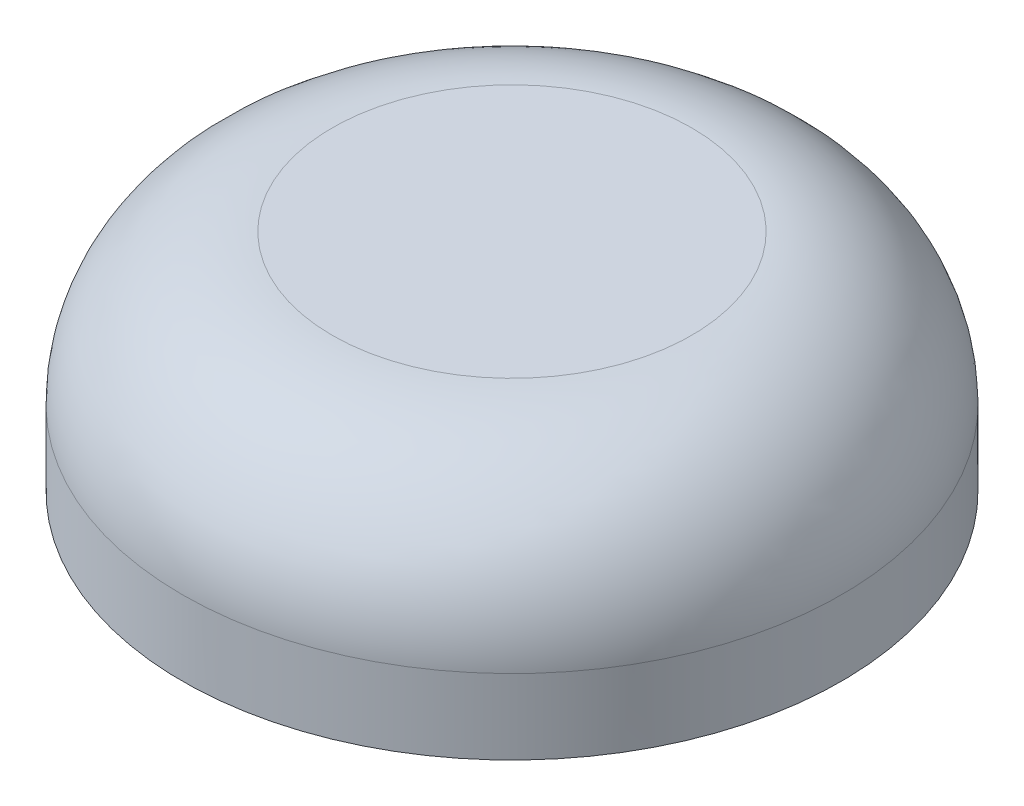
ISO-10303-21;
HEADER;
FILE_DESCRIPTION(('STEP AP214'),'2;1');
FILE_NAME('part.step','',(''),(''),'','','');
FILE_SCHEMA(('AUTOMOTIVE_DESIGN { 1 0 10303 214 1 1 1 1 }'));
ENDSEC;
DATA;
#1=APPLICATION_CONTEXT('core data for automotive mechanical design processes');
#2=APPLICATION_PROTOCOL_DEFINITION('international standard','automotive_design',2000,#1);
#3=PRODUCT_CONTEXT('',#1,'mechanical');
#4=PRODUCT('Part','Part','',(#3));
#5=PRODUCT_RELATED_PRODUCT_CATEGORY('part','',(#4));
#6=PRODUCT_DEFINITION_FORMATION('','',#4);
#7=PRODUCT_DEFINITION_CONTEXT('part definition',#1,'design');
#8=PRODUCT_DEFINITION('design','',#6,#7);
#9=PRODUCT_DEFINITION_SHAPE('','',#8);
#10=(LENGTH_UNIT() NAMED_UNIT(*) SI_UNIT(.MILLI.,.METRE.));
#11=(NAMED_UNIT(*) PLANE_ANGLE_UNIT() SI_UNIT($,.RADIAN.));
#12=(NAMED_UNIT(*) SI_UNIT($,.STERADIAN.) SOLID_ANGLE_UNIT());
#13=UNCERTAINTY_MEASURE_WITH_UNIT(LENGTH_MEASURE(1.E-05),#10,'distance_accuracy_value','');
#14=(GEOMETRIC_REPRESENTATION_CONTEXT(3) GLOBAL_UNCERTAINTY_ASSIGNED_CONTEXT((#13)) GLOBAL_UNIT_ASSIGNED_CONTEXT((#10,
#11,#12)) REPRESENTATION_CONTEXT('',''));
#15=CARTESIAN_POINT('',(0.,0.,0.));
#16=DIRECTION('',(0.,0.,1.));
#17=DIRECTION('',(1.,0.,0.));
#18=AXIS2_PLACEMENT_3D('',#15,#16,#17);
#19=CARTESIAN_POINT('',(0.,1.27,0.));
#20=DIRECTION('',(0.,1.,0.));
#21=DIRECTION('',(0.,0.,1.));
#22=AXIS2_PLACEMENT_3D('',#19,#20,#21);
#23=TOROIDAL_SURFACE('',#22,3.048,2.54);
#24=CARTESIAN_POINT('',(0.,3.81,0.));
#25=DIRECTION('',(0.,1.,0.));
#26=DIRECTION('',(0.,0.,1.));
#27=AXIS2_PLACEMENT_3D('',#24,#25,#26);
#28=CIRCLE('',#27,3.048);
#29=CARTESIAN_POINT('',(0.,3.81,3.048));
#30=VERTEX_POINT('',#29);
#31=EDGE_CURVE('E43',#30,#30,#28,.T.);
#32=ORIENTED_EDGE('',*,*,#31,.F.);
#33=EDGE_LOOP('',(#32));
#34=FACE_BOUND('',#33,.T.);
#35=CARTESIAN_POINT('',(0.,1.27,0.));
#36=DIRECTION('',(0.,1.,0.));
#37=DIRECTION('',(0.,0.,1.));
#38=AXIS2_PLACEMENT_3D('',#35,#36,#37);
#39=CIRCLE('',#38,5.588);
#40=CARTESIAN_POINT('',(0.,1.27,-5.588));
#41=VERTEX_POINT('',#40);
#42=EDGE_CURVE('E10',#41,#41,#39,.F.);
#43=ORIENTED_EDGE('',*,*,#42,.F.);
#44=EDGE_LOOP('',(#43));
#45=FACE_BOUND('',#44,.T.);
#46=ADVANCED_FACE('F36',(#34,#45),#23,.T.);
#47=CARTESIAN_POINT('',(0.,3.81,0.));
#48=DIRECTION('',(0.,-1.,0.));
#49=DIRECTION('',(0.,0.,-1.));
#50=AXIS2_PLACEMENT_3D('',#47,#48,#49);
#51=CYLINDRICAL_SURFACE('',#50,5.588);
#52=CARTESIAN_POINT('',(0.,0.,0.));
#53=DIRECTION('',(0.,1.,0.));
#54=DIRECTION('',(0.,0.,1.));
#55=AXIS2_PLACEMENT_3D('',#52,#53,#54);
#56=CIRCLE('',#55,5.588);
#57=CARTESIAN_POINT('',(0.,0.,-5.588));
#58=VERTEX_POINT('',#57);
#59=EDGE_CURVE('E48',#58,#58,#56,.T.);
#60=CARTESIAN_POINT('',(0.,1.27,-5.588));
#61=CARTESIAN_POINT('',(0.,1.25677083333333,-5.588));
#62=CARTESIAN_POINT('',(0.,1.24354166666667,-5.588));
#63=CARTESIAN_POINT('',(0.,1.21708333333333,-5.588));
#64=CARTESIAN_POINT('',(0.,1.20385416666667,-5.588));
#65=CARTESIAN_POINT('',(0.,1.17739583333333,-5.588));
#66=CARTESIAN_POINT('',(0.,1.16416666666667,-5.588));
#67=CARTESIAN_POINT('',(0.,1.13770833333333,-5.588));
#68=CARTESIAN_POINT('',(0.,1.12447916666667,-5.588));
#69=CARTESIAN_POINT('',(0.,1.09802083333333,-5.588));
#70=CARTESIAN_POINT('',(0.,1.08479166666667,-5.588));
#71=CARTESIAN_POINT('',(0.,1.05833333333333,-5.588));
#72=CARTESIAN_POINT('',(0.,1.04510416666667,-5.588));
#73=CARTESIAN_POINT('',(0.,1.01864583333333,-5.588));
#74=CARTESIAN_POINT('',(0.,1.00541666666667,-5.588));
#75=CARTESIAN_POINT('',(0.,0.978958333333332,-5.588));
#76=CARTESIAN_POINT('',(0.,0.965729166666666,-5.588));
#77=CARTESIAN_POINT('',(0.,0.939270833333332,-5.588));
#78=CARTESIAN_POINT('',(0.,0.926041666666666,-5.588));
#79=CARTESIAN_POINT('',(0.,0.899583333333332,-5.588));
#80=CARTESIAN_POINT('',(0.,0.886354166666666,-5.588));
#81=CARTESIAN_POINT('',(0.,0.859895833333332,-5.588));
#82=CARTESIAN_POINT('',(0.,0.846666666666666,-5.588));
#83=CARTESIAN_POINT('',(0.,0.820208333333333,-5.588));
#84=CARTESIAN_POINT('',(0.,0.806979166666666,-5.588));
#85=CARTESIAN_POINT('',(0.,0.780520833333333,-5.588));
#86=CARTESIAN_POINT('',(0.,0.767291666666666,-5.588));
#87=CARTESIAN_POINT('',(0.,0.740833333333332,-5.588));
#88=CARTESIAN_POINT('',(0.,0.727604166666666,-5.588));
#89=CARTESIAN_POINT('',(0.,0.701145833333333,-5.588));
#90=CARTESIAN_POINT('',(0.,0.687916666666666,-5.588));
#91=CARTESIAN_POINT('',(0.,0.661458333333332,-5.588));
#92=CARTESIAN_POINT('',(0.,0.648229166666666,-5.588));
#93=CARTESIAN_POINT('',(0.,0.621770833333333,-5.588));
#94=CARTESIAN_POINT('',(0.,0.608541666666666,-5.588));
#95=CARTESIAN_POINT('',(0.,0.582083333333333,-5.588));
#96=CARTESIAN_POINT('',(0.,0.568854166666666,-5.588));
#97=CARTESIAN_POINT('',(0.,0.542395833333333,-5.588));
#98=CARTESIAN_POINT('',(0.,0.529166666666666,-5.588));
#99=CARTESIAN_POINT('',(0.,0.502708333333333,-5.588));
#100=CARTESIAN_POINT('',(0.,0.489479166666666,-5.588));
#101=CARTESIAN_POINT('',(0.,0.463020833333333,-5.588));
#102=CARTESIAN_POINT('',(0.,0.449791666666666,-5.588));
#103=CARTESIAN_POINT('',(0.,0.423333333333333,-5.588));
#104=CARTESIAN_POINT('',(0.,0.410104166666666,-5.588));
#105=CARTESIAN_POINT('',(0.,0.383645833333333,-5.588));
#106=CARTESIAN_POINT('',(0.,0.370416666666666,-5.588));
#107=CARTESIAN_POINT('',(0.,0.343958333333333,-5.588));
#108=CARTESIAN_POINT('',(0.,0.330729166666666,-5.588));
#109=CARTESIAN_POINT('',(0.,0.304270833333333,-5.588));
#110=CARTESIAN_POINT('',(0.,0.291041666666666,-5.588));
#111=CARTESIAN_POINT('',(0.,0.264583333333333,-5.588));
#112=CARTESIAN_POINT('',(0.,0.251354166666666,-5.588));
#113=CARTESIAN_POINT('',(0.,0.224895833333333,-5.588));
#114=CARTESIAN_POINT('',(0.,0.211666666666666,-5.588));
#115=CARTESIAN_POINT('',(0.,0.185208333333333,-5.588));
#116=CARTESIAN_POINT('',(0.,0.171979166666667,-5.588));
#117=CARTESIAN_POINT('',(0.,0.145520833333333,-5.588));
#118=CARTESIAN_POINT('',(0.,0.132291666666667,-5.588));
#119=CARTESIAN_POINT('',(0.,0.105833333333333,-5.588));
#120=CARTESIAN_POINT('',(0.,0.0926041666666666,-5.588));
#121=CARTESIAN_POINT('',(0.,0.0661458333333333,-5.588));
#122=CARTESIAN_POINT('',(0.,0.0529166666666665,-5.588));
#123=CARTESIAN_POINT('',(0.,0.0264583333333332,-5.588));
#124=CARTESIAN_POINT('',(0.,0.0132291666666666,-5.588));
#125=CARTESIAN_POINT('',(0.,0.,-5.588));
#126=B_SPLINE_CURVE_WITH_KNOTS('',3,(#60,#61,#62,#63,#64,#65,#66,#67,#68,#69,#70,#71,#72,#73,
#74,#75,#76,#77,#78,#79,#80,#81,#82,#83,#84,#85,#86,#87,#88,#89,#90,#91,#92,#93,#94,#95,#96,#97,
#98,#99,#100,#101,#102,#103,#104,#105,#106,#107,#108,#109,#110,#111,#112,#113,#114,#115,#116,
#117,#118,#119,#120,#121,#122,#123,#124,#125),.UNSPECIFIED.,.F.,.F.,(4,2,2,2,2,2,2,2,2,2,2,2,2,
2,2,2,2,2,2,2,2,2,2,2,2,2,2,2,2,2,2,2,4),(0.,0.0396874999999998,0.079375,0.1190625,0.15875,
0.1984375,0.238125,0.2778125,0.3175,0.357187499999999,0.396875,0.436562499999999,
0.476249999999999,0.515937499999999,0.555624999999999,0.595312499999999,0.634999999999999,
0.674687499999999,0.714374999999999,0.754062499999999,0.793749999999999,0.833437499999999,
0.873124999999999,0.912812499999999,0.952499999999999,0.992187499999999,1.031875,1.0715625,
1.11125,1.1509375,1.190625,1.2303125,1.27),.UNSPECIFIED.);
#127=EDGE_CURVE('BSEAM79',#41,#58,#126,.T.);
#128=ORIENTED_EDGE('',*,*,#42,.T.);
#129=ORIENTED_EDGE('',*,*,#59,.T.);
#130=ORIENTED_EDGE('',*,*,#127,.T.);
#131=ORIENTED_EDGE('',*,*,#127,.F.);
#132=EDGE_LOOP('',(#128,#130,#129,#131));
#133=FACE_BOUND('',#132,.T.);
#134=ADVANCED_FACE('F79',(#133),#51,.T.);
#135=CARTESIAN_POINT('',(0.,3.81,0.));
#136=DIRECTION('',(0.,1.,0.));
#137=DIRECTION('',(0.,0.,1.));
#138=AXIS2_PLACEMENT_3D('',#135,#136,#137);
#139=PLANE('',#138);
#140=ORIENTED_EDGE('',*,*,#31,.T.);
#141=EDGE_LOOP('',(#140));
#142=FACE_BOUND('',#141,.T.);
#143=ADVANCED_FACE('F75',(#142),#139,.T.);
#144=CARTESIAN_POINT('',(0.,0.,0.));
#145=DIRECTION('',(0.,1.,0.));
#146=DIRECTION('',(0.,0.,1.));
#147=AXIS2_PLACEMENT_3D('',#144,#145,#146);
#148=PLANE('',#147);
#149=CARTESIAN_POINT('',(0.,0.,0.));
#150=DIRECTION('',(0.,-1.,0.));
#151=DIRECTION('',(0.,0.,-1.));
#152=AXIS2_PLACEMENT_3D('',#149,#150,#151);
#153=CIRCLE('',#152,1.27);
#154=CARTESIAN_POINT('',(0.,0.,-1.27));
#155=VERTEX_POINT('',#154);
#156=EDGE_CURVE('E56',#155,#155,#153,.T.);
#157=ORIENTED_EDGE('',*,*,#156,.F.);
#158=EDGE_LOOP('',(#157));
#159=FACE_BOUND('',#158,.T.);
#160=ORIENTED_EDGE('',*,*,#59,.F.);
#161=EDGE_LOOP('',(#160));
#162=FACE_BOUND('',#161,.T.);
#163=ADVANCED_FACE('F69',(#159,#162),#148,.F.);
#164=CARTESIAN_POINT('',(0.,2.54,0.));
#165=DIRECTION('',(0.,-1.,0.));
#166=DIRECTION('',(0.,0.,-1.));
#167=AXIS2_PLACEMENT_3D('',#164,#165,#166);
#168=CYLINDRICAL_SURFACE('',#167,1.27);
#169=CARTESIAN_POINT('',(0.,2.54,0.));
#170=DIRECTION('',(0.,-1.,0.));
#171=DIRECTION('',(0.,0.,-1.));
#172=AXIS2_PLACEMENT_3D('',#169,#170,#171);
#173=CIRCLE('',#172,1.27);
#174=CARTESIAN_POINT('',(0.,2.54,-1.27));
#175=VERTEX_POINT('',#174);
#176=EDGE_CURVE('E53',#175,#175,#173,.T.);
#177=ORIENTED_EDGE('',*,*,#176,.F.);
#178=EDGE_LOOP('',(#177));
#179=FACE_BOUND('',#178,.T.);
#180=ORIENTED_EDGE('',*,*,#156,.T.);
#181=EDGE_LOOP('',(#180));
#182=FACE_BOUND('',#181,.T.);
#183=ADVANCED_FACE('F66',(#179,#182),#168,.F.);
#184=CARTESIAN_POINT('',(0.,2.54,0.));
#185=DIRECTION('',(0.,-1.,0.));
#186=DIRECTION('',(0.,0.,-1.));
#187=AXIS2_PLACEMENT_3D('',#184,#185,#186);
#188=PLANE('',#187);
#189=ORIENTED_EDGE('',*,*,#176,.T.);
#190=EDGE_LOOP('',(#189));
#191=FACE_BOUND('',#190,.T.);
#192=ADVANCED_FACE('F64',(#191),#188,.T.);
#193=CLOSED_SHELL('',(#46,#134,#143,#163,#183,#192));
#194=MANIFOLD_SOLID_BREP('B2',#193);
#195=ADVANCED_BREP_SHAPE_REPRESENTATION('',(#18,#194),#14);
#196=SHAPE_DEFINITION_REPRESENTATION(#9,#195);
ENDSEC;
END-ISO-10303-21;
